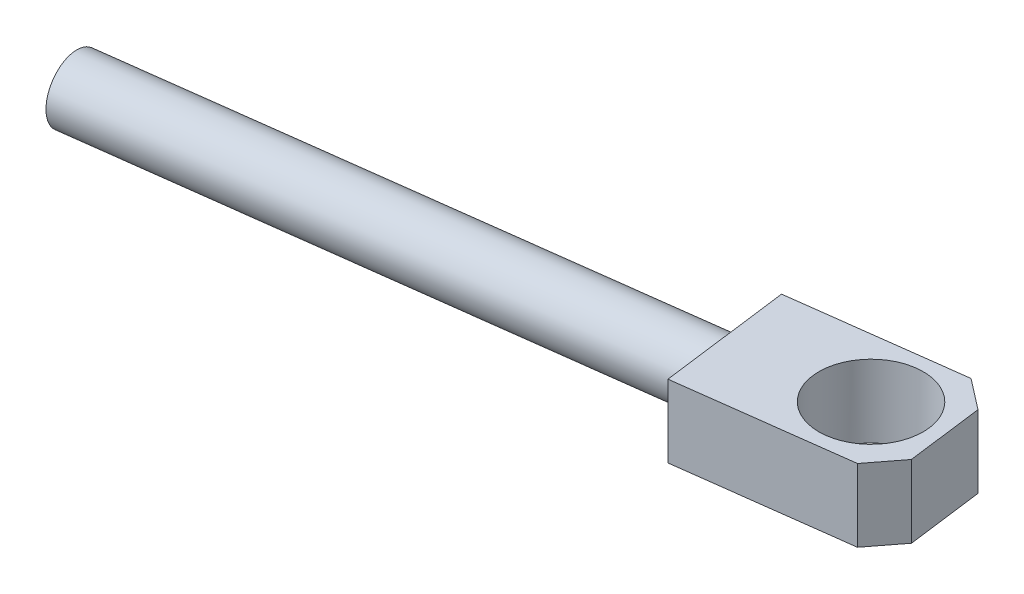
ISO-10303-21;
HEADER;
FILE_DESCRIPTION(('STEP AP214'),'2;1');
FILE_NAME('part.step','',(''),(''),'','','');
FILE_SCHEMA(('AUTOMOTIVE_DESIGN { 1 0 10303 214 1 1 1 1 }'));
ENDSEC;
DATA;
#1=APPLICATION_CONTEXT('core data for automotive mechanical design processes');
#2=APPLICATION_PROTOCOL_DEFINITION('international standard','automotive_design',2000,#1);
#3=PRODUCT_CONTEXT('',#1,'mechanical');
#4=PRODUCT('Part','Part','',(#3));
#5=PRODUCT_RELATED_PRODUCT_CATEGORY('part','',(#4));
#6=PRODUCT_DEFINITION_FORMATION('','',#4);
#7=PRODUCT_DEFINITION_CONTEXT('part definition',#1,'design');
#8=PRODUCT_DEFINITION('design','',#6,#7);
#9=PRODUCT_DEFINITION_SHAPE('','',#8);
#10=(LENGTH_UNIT() NAMED_UNIT(*) SI_UNIT(.MILLI.,.METRE.));
#11=(NAMED_UNIT(*) PLANE_ANGLE_UNIT() SI_UNIT($,.RADIAN.));
#12=(NAMED_UNIT(*) SI_UNIT($,.STERADIAN.) SOLID_ANGLE_UNIT());
#13=UNCERTAINTY_MEASURE_WITH_UNIT(LENGTH_MEASURE(1.E-05),#10,'distance_accuracy_value','');
#14=(GEOMETRIC_REPRESENTATION_CONTEXT(3) GLOBAL_UNCERTAINTY_ASSIGNED_CONTEXT((#13)) GLOBAL_UNIT_ASSIGNED_CONTEXT((#10,
#11,#12)) REPRESENTATION_CONTEXT('',''));
#15=CARTESIAN_POINT('',(0.,0.,0.));
#16=DIRECTION('',(0.,0.,1.));
#17=DIRECTION('',(1.,0.,0.));
#18=AXIS2_PLACEMENT_3D('',#15,#16,#17);
#19=CARTESIAN_POINT('',(101.604986039057,-231.,1251.88845844159));
#20=DIRECTION('',(-0.991722729757381,0.,0.128397925538417));
#21=DIRECTION('',(-0.128397925538417,0.,-0.991722729757381));
#22=AXIS2_PLACEMENT_3D('',#19,#20,#21);
#23=CYLINDRICAL_SURFACE('',#22,35.0000000000009);
#24=CARTESIAN_POINT('',(155.158013445956,-231.,1244.95497046251));
#25=DIRECTION('',(0.991722729757381,0.,-0.128397925538416));
#26=DIRECTION('',(-0.128397925538416,0.,-0.991722729757381));
#27=AXIS2_PLACEMENT_3D('',#24,#25,#26);
#28=CIRCLE('',#27,35.000000000001);
#29=CARTESIAN_POINT('',(150.664086052112,-231.,1210.244674921));
#30=VERTEX_POINT('',#29);
#31=EDGE_CURVE('E11',#30,#30,#28,.F.);
#32=ORIENTED_EDGE('',*,*,#31,.T.);
#33=EDGE_LOOP('',(#32));
#34=FACE_BOUND('',#33,.T.);
#35=CARTESIAN_POINT('',(-480.536256328546,-231.,1327.25804073264));
#36=DIRECTION('',(-0.991722729757381,0.,0.128397925538417));
#37=DIRECTION('',(0.128397925538417,0.,0.991722729757381));
#38=AXIS2_PLACEMENT_3D('',#35,#36,#37);
#39=CIRCLE('',#38,35.0000000000009);
#40=CARTESIAN_POINT('',(-476.042328934701,-231.,1361.96833627415));
#41=VERTEX_POINT('',#40);
#42=EDGE_CURVE('E20',#41,#41,#39,.T.);
#43=ORIENTED_EDGE('',*,*,#42,.F.);
#44=EDGE_LOOP('',(#43));
#45=FACE_BOUND('',#44,.T.);
#46=ADVANCED_FACE('F17',(#34,#45),#23,.T.);
#47=CARTESIAN_POINT('',(297.966086531023,-271.,1226.46566918498));
#48=DIRECTION('',(0.,1.,0.));
#49=DIRECTION('',(0.128397925538417,0.,0.991722729757381));
#50=AXIS2_PLACEMENT_3D('',#47,#48,#49);
#51=CYLINDRICAL_SURFACE('',#50,57.5000000000012);
#52=CARTESIAN_POINT('',(297.966086531023,-271.,1226.46566918498));
#53=DIRECTION('',(0.,-1.,0.));
#54=DIRECTION('',(0.,0.,-1.));
#55=AXIS2_PLACEMENT_3D('',#52,#53,#54);
#56=CIRCLE('',#55,57.5000000000011);
#57=CARTESIAN_POINT('',(297.966086531023,-271.,1168.96566918498));
#58=VERTEX_POINT('',#57);
#59=EDGE_CURVE('E122',#58,#58,#56,.T.);
#60=ORIENTED_EDGE('',*,*,#59,.T.);
#61=EDGE_LOOP('',(#60));
#62=FACE_BOUND('',#61,.T.);
#63=CARTESIAN_POINT('',(297.966086531023,-191.,1226.46566918498));
#64=DIRECTION('',(0.,1.,0.));
#65=DIRECTION('',(0.,0.,1.));
#66=AXIS2_PLACEMENT_3D('',#63,#64,#65);
#67=CIRCLE('',#66,57.5000000000011);
#68=CARTESIAN_POINT('',(297.966086531023,-191.,1283.96566918498));
#69=VERTEX_POINT('',#68);
#70=EDGE_CURVE('E146',#69,#69,#67,.T.);
#71=ORIENTED_EDGE('',*,*,#70,.T.);
#72=EDGE_LOOP('',(#71));
#73=FACE_BOUND('',#72,.T.);
#74=ADVANCED_FACE('F156',(#62,#73),#51,.F.);
#75=CARTESIAN_POINT('',(164.466863047492,-271.,1316.85486836992));
#76=DIRECTION('',(0.991722729757381,0.,-0.128397925538416));
#77=DIRECTION('',(0.128397925538417,0.,0.991722729757381));
#78=AXIS2_PLACEMENT_3D('',#75,#76,#77);
#79=PLANE('',#78);
#80=DIRECTION('',(-0.128397925538417,0.,-0.991722729757381));
#81=VECTOR('',#80,1.);
#82=CARTESIAN_POINT('',(164.466863047492,-191.,1316.85486836992));
#83=LINE('',#82,#81);
#84=CARTESIAN_POINT('',(164.466863047492,-191.,1316.85486836992));
#85=VERTEX_POINT('',#84);
#86=CARTESIAN_POINT('',(145.849163844421,-191.,1173.0550725551));
#87=VERTEX_POINT('',#86);
#88=EDGE_CURVE('E110',#85,#87,#83,.T.);
#89=ORIENTED_EDGE('',*,*,#88,.T.);
#90=DIRECTION('',(0.,1.,0.));
#91=VECTOR('',#90,1.);
#92=CARTESIAN_POINT('',(145.849163844421,-271.,1173.0550725551));
#93=LINE('',#92,#91);
#94=CARTESIAN_POINT('',(145.849163844421,-271.,1173.0550725551));
#95=VERTEX_POINT('',#94);
#96=EDGE_CURVE('E26',#95,#87,#93,.T.);
#97=ORIENTED_EDGE('',*,*,#96,.F.);
#98=DIRECTION('',(-0.128397925538417,0.,-0.991722729757381));
#99=VECTOR('',#98,1.);
#100=CARTESIAN_POINT('',(164.466863047492,-271.,1316.85486836992));
#101=LINE('',#100,#99);
#102=CARTESIAN_POINT('',(164.466863047492,-271.,1316.85486836992));
#103=VERTEX_POINT('',#102);
#104=EDGE_CURVE('E104',#103,#95,#101,.T.);
#105=ORIENTED_EDGE('',*,*,#104,.F.);
#106=DIRECTION('',(0.,1.,0.));
#107=VECTOR('',#106,1.);
#108=CARTESIAN_POINT('',(164.466863047492,-271.,1316.85486836992));
#109=LINE('',#108,#107);
#110=EDGE_CURVE('E100',#103,#85,#109,.T.);
#111=ORIENTED_EDGE('',*,*,#110,.T.);
#112=EDGE_LOOP('',(#89,#97,#105,#111));
#113=FACE_BOUND('',#112,.T.);
#114=ORIENTED_EDGE('',*,*,#31,.F.);
#115=EDGE_LOOP('',(#114));
#116=FACE_BOUND('',#115,.T.);
#117=ADVANCED_FACE('F134',(#113,#116),#79,.F.);
#118=CARTESIAN_POINT('',(164.466863047492,-191.,1316.85486836992));
#119=DIRECTION('',(0.,1.,0.));
#120=DIRECTION('',(-0.991722729757381,0.,0.128397925538417));
#121=AXIS2_PLACEMENT_3D('',#118,#119,#120);
#122=PLANE('',#121);
#123=ORIENTED_EDGE('',*,*,#88,.F.);
#124=DIRECTION('',(-0.991722729757381,0.,0.128397925538416));
#125=VECTOR('',#124,1.);
#126=CARTESIAN_POINT('',(349.423152147247,-191.,1292.90865525701));
#127=LINE('',#126,#125);
#128=CARTESIAN_POINT('',(349.423152147247,-191.,1292.90865525701));
#129=VERTEX_POINT('',#128);
#130=EDGE_CURVE('E63',#129,#85,#127,.T.);
#131=ORIENTED_EDGE('',*,*,#130,.F.);
#132=DIRECTION('',(-0.610462823429778,0.,0.792044911106778));
#133=VECTOR('',#132,1.);
#134=CARTESIAN_POINT('',(375.322896273817,-191.,1259.30503559813));
#135=LINE('',#134,#133);
#136=CARTESIAN_POINT('',(375.322896273817,-191.,1259.30503559813));
#137=VERTEX_POINT('',#136);
#138=EDGE_CURVE('E57',#137,#129,#135,.T.);
#139=ORIENTED_EDGE('',*,*,#138,.F.);
#140=DIRECTION('',(0.128397925538417,0.,0.991722729757381));
#141=VECTOR('',#140,1.);
#142=CARTESIAN_POINT('',(364.409072603051,-191.,1175.00860356875));
#143=LINE('',#142,#141);
#144=CARTESIAN_POINT('',(364.409072603051,-191.,1175.00860356875));
#145=VERTEX_POINT('',#144);
#146=EDGE_CURVE('E94',#145,#137,#143,.T.);
#147=ORIENTED_EDGE('',*,*,#146,.F.);
#148=DIRECTION('',(0.792044911106778,0.,0.610462823429778));
#149=VECTOR('',#148,1.);
#150=CARTESIAN_POINT('',(364.409072603051,-191.,1175.00860356875));
#151=LINE('',#150,#149);
#152=CARTESIAN_POINT('',(330.805452944177,-191.,1149.10885944218));
#153=VERTEX_POINT('',#152);
#154=EDGE_CURVE('E109',#153,#145,#151,.T.);
#155=ORIENTED_EDGE('',*,*,#154,.F.);
#156=DIRECTION('',(0.991722729757381,0.,-0.128397925538417));
#157=VECTOR('',#156,1.);
#158=CARTESIAN_POINT('',(145.849163844421,-191.,1173.0550725551));
#159=LINE('',#158,#157);
#160=EDGE_CURVE('E106',#87,#153,#159,.T.);
#161=ORIENTED_EDGE('',*,*,#160,.F.);
#162=EDGE_LOOP('',(#123,#131,#139,#147,#155,#161));
#163=FACE_BOUND('',#162,.T.);
#164=ORIENTED_EDGE('',*,*,#70,.F.);
#165=EDGE_LOOP('',(#164));
#166=FACE_BOUND('',#165,.T.);
#167=ADVANCED_FACE('F137',(#163,#166),#122,.T.);
#168=CARTESIAN_POINT('',(164.466863047492,-271.,1316.85486836992));
#169=DIRECTION('',(0.,1.,0.));
#170=DIRECTION('',(-0.991722729757381,0.,0.128397925538417));
#171=AXIS2_PLACEMENT_3D('',#168,#169,#170);
#172=PLANE('',#171);
#173=ORIENTED_EDGE('',*,*,#104,.T.);
#174=DIRECTION('',(0.991722729757381,0.,-0.128397925538417));
#175=VECTOR('',#174,1.);
#176=CARTESIAN_POINT('',(145.849163844421,-271.,1173.0550725551));
#177=LINE('',#176,#175);
#178=CARTESIAN_POINT('',(330.805452944177,-271.,1149.10885944218));
#179=VERTEX_POINT('',#178);
#180=EDGE_CURVE('E72',#95,#179,#177,.T.);
#181=ORIENTED_EDGE('',*,*,#180,.T.);
#182=DIRECTION('',(0.792044911106778,0.,0.610462823429778));
#183=VECTOR('',#182,1.);
#184=CARTESIAN_POINT('',(364.409072603051,-271.,1175.00860356875));
#185=LINE('',#184,#183);
#186=CARTESIAN_POINT('',(364.409072603051,-271.,1175.00860356875));
#187=VERTEX_POINT('',#186);
#188=EDGE_CURVE('E86',#179,#187,#185,.T.);
#189=ORIENTED_EDGE('',*,*,#188,.T.);
#190=DIRECTION('',(0.128397925538417,0.,0.991722729757381));
#191=VECTOR('',#190,1.);
#192=CARTESIAN_POINT('',(364.409072603051,-271.,1175.00860356875));
#193=LINE('',#192,#191);
#194=CARTESIAN_POINT('',(375.322896273817,-271.,1259.30503559813));
#195=VERTEX_POINT('',#194);
#196=EDGE_CURVE('E79',#187,#195,#193,.T.);
#197=ORIENTED_EDGE('',*,*,#196,.T.);
#198=DIRECTION('',(-0.610462823429778,0.,0.792044911106778));
#199=VECTOR('',#198,1.);
#200=CARTESIAN_POINT('',(375.322896273817,-271.,1259.30503559813));
#201=LINE('',#200,#199);
#202=CARTESIAN_POINT('',(349.423152147247,-271.,1292.90865525701));
#203=VERTEX_POINT('',#202);
#204=EDGE_CURVE('E84',#195,#203,#201,.T.);
#205=ORIENTED_EDGE('',*,*,#204,.T.);
#206=DIRECTION('',(-0.991722729757381,0.,0.128397925538416));
#207=VECTOR('',#206,1.);
#208=CARTESIAN_POINT('',(349.423152147247,-271.,1292.90865525701));
#209=LINE('',#208,#207);
#210=EDGE_CURVE('E34',#203,#103,#209,.T.);
#211=ORIENTED_EDGE('',*,*,#210,.T.);
#212=EDGE_LOOP('',(#173,#181,#189,#197,#205,#211));
#213=FACE_BOUND('',#212,.T.);
#214=ORIENTED_EDGE('',*,*,#59,.F.);
#215=EDGE_LOOP('',(#214));
#216=FACE_BOUND('',#215,.T.);
#217=ADVANCED_FACE('F81',(#213,#216),#172,.F.);
#218=CARTESIAN_POINT('',(349.423152147247,-271.,1292.90865525701));
#219=DIRECTION('',(-0.128397925538417,0.,-0.991722729757381));
#220=DIRECTION('',(0.991722729757381,0.,-0.128397925538416));
#221=AXIS2_PLACEMENT_3D('',#218,#219,#220);
#222=PLANE('',#221);
#223=ORIENTED_EDGE('',*,*,#130,.T.);
#224=ORIENTED_EDGE('',*,*,#110,.F.);
#225=ORIENTED_EDGE('',*,*,#210,.F.);
#226=DIRECTION('',(0.,1.,0.));
#227=VECTOR('',#226,1.);
#228=CARTESIAN_POINT('',(349.423152147247,-271.,1292.90865525701));
#229=LINE('',#228,#227);
#230=EDGE_CURVE('E96',#203,#129,#229,.T.);
#231=ORIENTED_EDGE('',*,*,#230,.T.);
#232=EDGE_LOOP('',(#223,#224,#225,#231));
#233=FACE_BOUND('',#232,.T.);
#234=ADVANCED_FACE('F179',(#233),#222,.F.);
#235=CARTESIAN_POINT('',(375.322896273817,-271.,1259.30503559813));
#236=DIRECTION('',(-0.792044911106778,0.,-0.610462823429778));
#237=DIRECTION('',(0.610462823429778,0.,-0.792044911106778));
#238=AXIS2_PLACEMENT_3D('',#235,#236,#237);
#239=PLANE('',#238);
#240=ORIENTED_EDGE('',*,*,#138,.T.);
#241=ORIENTED_EDGE('',*,*,#230,.F.);
#242=ORIENTED_EDGE('',*,*,#204,.F.);
#243=DIRECTION('',(0.,1.,0.));
#244=VECTOR('',#243,1.);
#245=CARTESIAN_POINT('',(375.322896273817,-271.,1259.30503559813));
#246=LINE('',#245,#244);
#247=EDGE_CURVE('E91',#195,#137,#246,.T.);
#248=ORIENTED_EDGE('',*,*,#247,.T.);
#249=EDGE_LOOP('',(#240,#241,#242,#248));
#250=FACE_BOUND('',#249,.T.);
#251=ADVANCED_FACE('F98',(#250),#239,.F.);
#252=CARTESIAN_POINT('',(364.409072603051,-271.,1175.00860356875));
#253=DIRECTION('',(-0.991722729757381,0.,0.128397925538417));
#254=DIRECTION('',(-0.128397925538417,0.,-0.991722729757381));
#255=AXIS2_PLACEMENT_3D('',#252,#253,#254);
#256=PLANE('',#255);
#257=ORIENTED_EDGE('',*,*,#146,.T.);
#258=ORIENTED_EDGE('',*,*,#247,.F.);
#259=ORIENTED_EDGE('',*,*,#196,.F.);
#260=DIRECTION('',(0.,1.,0.));
#261=VECTOR('',#260,1.);
#262=CARTESIAN_POINT('',(364.409072603051,-271.,1175.00860356875));
#263=LINE('',#262,#261);
#264=EDGE_CURVE('E95',#187,#145,#263,.T.);
#265=ORIENTED_EDGE('',*,*,#264,.T.);
#266=EDGE_LOOP('',(#257,#258,#259,#265));
#267=FACE_BOUND('',#266,.T.);
#268=ADVANCED_FACE('F92',(#267),#256,.F.);
#269=CARTESIAN_POINT('',(364.409072603051,-271.,1175.00860356875));
#270=DIRECTION('',(-0.610462823429778,0.,0.792044911106778));
#271=DIRECTION('',(-0.792044911106778,0.,-0.610462823429778));
#272=AXIS2_PLACEMENT_3D('',#269,#270,#271);
#273=PLANE('',#272);
#274=ORIENTED_EDGE('',*,*,#154,.T.);
#275=ORIENTED_EDGE('',*,*,#264,.F.);
#276=ORIENTED_EDGE('',*,*,#188,.F.);
#277=DIRECTION('',(0.,1.,0.));
#278=VECTOR('',#277,1.);
#279=CARTESIAN_POINT('',(330.805452944177,-271.,1149.10885944218));
#280=LINE('',#279,#278);
#281=EDGE_CURVE('E126',#179,#153,#280,.T.);
#282=ORIENTED_EDGE('',*,*,#281,.T.);
#283=EDGE_LOOP('',(#274,#275,#276,#282));
#284=FACE_BOUND('',#283,.T.);
#285=ADVANCED_FACE('F141',(#284),#273,.F.);
#286=CARTESIAN_POINT('',(145.849163844421,-271.,1173.0550725551));
#287=DIRECTION('',(0.128397925538417,0.,0.991722729757381));
#288=DIRECTION('',(0.,-1.,0.));
#289=AXIS2_PLACEMENT_3D('',#286,#287,#288);
#290=PLANE('',#289);
#291=ORIENTED_EDGE('',*,*,#160,.T.);
#292=ORIENTED_EDGE('',*,*,#281,.F.);
#293=ORIENTED_EDGE('',*,*,#180,.F.);
#294=ORIENTED_EDGE('',*,*,#96,.T.);
#295=EDGE_LOOP('',(#291,#292,#293,#294));
#296=FACE_BOUND('',#295,.T.);
#297=ADVANCED_FACE('F130',(#296),#290,.F.);
#298=CARTESIAN_POINT('',(-501.991039935721,-131.694394029859,1161.54510981075));
#299=DIRECTION('',(-0.991722729757381,0.,0.128397925538417));
#300=DIRECTION('',(0.128397925538417,0.,0.991722729757381));
#301=AXIS2_PLACEMENT_3D('',#298,#299,#300);
#302=PLANE('',#301);
#303=ORIENTED_EDGE('',*,*,#42,.T.);
#304=EDGE_LOOP('',(#303));
#305=FACE_BOUND('',#304,.T.);
#306=ADVANCED_FACE('F153',(#305),#302,.T.);
#307=CLOSED_SHELL('',(#46,#74,#117,#167,#217,#234,#251,#268,#285,#297,#306));
#308=MANIFOLD_SOLID_BREP('B1',#307);
#309=ADVANCED_BREP_SHAPE_REPRESENTATION('',(#18,#308),#14);
#310=SHAPE_DEFINITION_REPRESENTATION(#9,#309);
ENDSEC;
END-ISO-10303-21;
